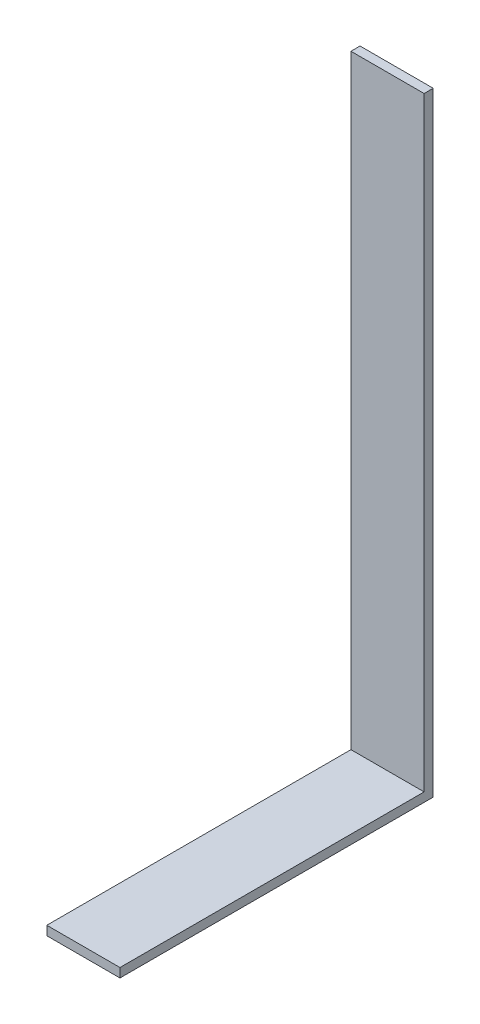
ISO-10303-21;
HEADER;
FILE_DESCRIPTION(('STEP AP214'),'2;1');
FILE_NAME('part.step','',(''),(''),'','','');
FILE_SCHEMA(('AUTOMOTIVE_DESIGN { 1 0 10303 214 1 1 1 1 }'));
ENDSEC;
DATA;
#1=APPLICATION_CONTEXT('core data for automotive mechanical design processes');
#2=APPLICATION_PROTOCOL_DEFINITION('international standard','automotive_design',2000,#1);
#3=PRODUCT_CONTEXT('',#1,'mechanical');
#4=PRODUCT('Part','Part','',(#3));
#5=PRODUCT_RELATED_PRODUCT_CATEGORY('part','',(#4));
#6=PRODUCT_DEFINITION_FORMATION('','',#4);
#7=PRODUCT_DEFINITION_CONTEXT('part definition',#1,'design');
#8=PRODUCT_DEFINITION('design','',#6,#7);
#9=PRODUCT_DEFINITION_SHAPE('','',#8);
#10=(LENGTH_UNIT() NAMED_UNIT(*) SI_UNIT(.MILLI.,.METRE.));
#11=(NAMED_UNIT(*) PLANE_ANGLE_UNIT() SI_UNIT($,.RADIAN.));
#12=(NAMED_UNIT(*) SI_UNIT($,.STERADIAN.) SOLID_ANGLE_UNIT());
#13=UNCERTAINTY_MEASURE_WITH_UNIT(LENGTH_MEASURE(1.E-05),#10,'distance_accuracy_value','');
#14=(GEOMETRIC_REPRESENTATION_CONTEXT(3) GLOBAL_UNCERTAINTY_ASSIGNED_CONTEXT((#13)) GLOBAL_UNIT_ASSIGNED_CONTEXT((#10,
#11,#12)) REPRESENTATION_CONTEXT('',''));
#15=CARTESIAN_POINT('',(0.,0.,0.));
#16=DIRECTION('',(0.,0.,1.));
#17=DIRECTION('',(1.,0.,0.));
#18=AXIS2_PLACEMENT_3D('',#15,#16,#17);
#19=CARTESIAN_POINT('',(25.4,3.155,285.44));
#20=DIRECTION('',(-1.,0.,0.));
#21=DIRECTION('',(0.,0.,1.));
#22=AXIS2_PLACEMENT_3D('',#19,#20,#21);
#23=PLANE('',#22);
#24=DIRECTION('',(0.,1.,0.));
#25=VECTOR('',#24,1.);
#26=CARTESIAN_POINT('',(25.4,3.155,0.));
#27=LINE('',#26,#25);
#28=CARTESIAN_POINT('',(25.4,-3.155,0.));
#29=VERTEX_POINT('',#28);
#30=CARTESIAN_POINT('',(25.4,423.015,0.));
#31=VERTEX_POINT('',#30);
#32=EDGE_CURVE('E109',#29,#31,#27,.T.);
#33=ORIENTED_EDGE('',*,*,#32,.T.);
#34=DIRECTION('',(0.,0.,-1.));
#35=VECTOR('',#34,1.);
#36=CARTESIAN_POINT('',(25.4,423.015,48.1200000000001));
#37=LINE('',#36,#35);
#38=CARTESIAN_POINT('',(25.4,423.015,6.31));
#39=VERTEX_POINT('',#38);
#40=EDGE_CURVE('E89',#39,#31,#37,.T.);
#41=ORIENTED_EDGE('',*,*,#40,.F.);
#42=DIRECTION('',(0.,-1.,0.));
#43=VECTOR('',#42,1.);
#44=CARTESIAN_POINT('',(25.4,541.355,6.31));
#45=LINE('',#44,#43);
#46=CARTESIAN_POINT('',(25.4,3.155,6.31000000000004));
#47=VERTEX_POINT('',#46);
#48=EDGE_CURVE('E135',#39,#47,#45,.T.);
#49=ORIENTED_EDGE('',*,*,#48,.T.);
#50=DIRECTION('',(0.,0.,-1.));
#51=VECTOR('',#50,1.);
#52=CARTESIAN_POINT('',(25.4,3.155,285.44));
#53=LINE('',#52,#51);
#54=CARTESIAN_POINT('',(25.4,3.155,217.44));
#55=VERTEX_POINT('',#54);
#56=EDGE_CURVE('E44',#55,#47,#53,.T.);
#57=ORIENTED_EDGE('',*,*,#56,.F.);
#58=DIRECTION('',(0.,-1.,0.));
#59=VECTOR('',#58,1.);
#60=CARTESIAN_POINT('',(25.4,6.845,217.44));
#61=LINE('',#60,#59);
#62=CARTESIAN_POINT('',(25.4,-3.155,217.44));
#63=VERTEX_POINT('',#62);
#64=EDGE_CURVE('E140',#55,#63,#61,.T.);
#65=ORIENTED_EDGE('',*,*,#64,.T.);
#66=DIRECTION('',(0.,0.,-1.));
#67=VECTOR('',#66,1.);
#68=CARTESIAN_POINT('',(25.4,-3.155,285.44));
#69=LINE('',#68,#67);
#70=EDGE_CURVE('E111',#63,#29,#69,.T.);
#71=ORIENTED_EDGE('',*,*,#70,.T.);
#72=EDGE_LOOP('',(#33,#41,#49,#57,#65,#71));
#73=FACE_BOUND('',#72,.T.);
#74=ADVANCED_FACE('F37',(#73),#23,.F.);
#75=CARTESIAN_POINT('',(-25.4,3.155,285.44));
#76=DIRECTION('',(0.,-1.,0.));
#77=DIRECTION('',(0.,0.,-1.));
#78=AXIS2_PLACEMENT_3D('',#75,#76,#77);
#79=PLANE('',#78);
#80=DIRECTION('',(0.,0.,-1.));
#81=VECTOR('',#80,1.);
#82=CARTESIAN_POINT('',(-25.4,3.155,285.44));
#83=LINE('',#82,#81);
#84=CARTESIAN_POINT('',(-25.4,3.155,217.44));
#85=VERTEX_POINT('',#84);
#86=CARTESIAN_POINT('',(-25.4,3.155,6.30999999999998));
#87=VERTEX_POINT('',#86);
#88=EDGE_CURVE('E120',#85,#87,#83,.T.);
#89=ORIENTED_EDGE('',*,*,#88,.F.);
#90=DIRECTION('',(1.,0.,0.));
#91=VECTOR('',#90,1.);
#92=CARTESIAN_POINT('',(-25.4,3.155,217.44));
#93=LINE('',#92,#91);
#94=EDGE_CURVE('E129',#85,#55,#93,.T.);
#95=ORIENTED_EDGE('',*,*,#94,.T.);
#96=ORIENTED_EDGE('',*,*,#56,.T.);
#97=DIRECTION('',(-1.,0.,0.));
#98=VECTOR('',#97,1.);
#99=CARTESIAN_POINT('',(-25.3999999999999,3.155,6.30999999999998));
#100=LINE('',#99,#98);
#101=EDGE_CURVE('E113',#47,#87,#100,.T.);
#102=ORIENTED_EDGE('',*,*,#101,.T.);
#103=EDGE_LOOP('',(#89,#95,#96,#102));
#104=FACE_BOUND('',#103,.T.);
#105=ADVANCED_FACE('F128',(#104),#79,.F.);
#106=CARTESIAN_POINT('',(-25.4,3.155,285.44));
#107=DIRECTION('',(1.,0.,0.));
#108=DIRECTION('',(0.,0.,-1.));
#109=AXIS2_PLACEMENT_3D('',#106,#107,#108);
#110=PLANE('',#109);
#111=DIRECTION('',(0.,-1.,0.));
#112=VECTOR('',#111,1.);
#113=CARTESIAN_POINT('',(-25.4,541.355,6.30999999999998));
#114=LINE('',#113,#112);
#115=CARTESIAN_POINT('',(-25.4,423.015,6.30999999999998));
#116=VERTEX_POINT('',#115);
#117=EDGE_CURVE('E103',#116,#87,#114,.T.);
#118=ORIENTED_EDGE('',*,*,#117,.F.);
#119=DIRECTION('',(0.,0.,-1.));
#120=VECTOR('',#119,1.);
#121=CARTESIAN_POINT('',(-25.4,423.015,48.1200000000001));
#122=LINE('',#121,#120);
#123=CARTESIAN_POINT('',(-25.4,423.015,0.));
#124=VERTEX_POINT('',#123);
#125=EDGE_CURVE('E50',#116,#124,#122,.T.);
#126=ORIENTED_EDGE('',*,*,#125,.T.);
#127=DIRECTION('',(0.,-1.,0.));
#128=VECTOR('',#127,1.);
#129=CARTESIAN_POINT('',(-25.4,3.155,0.));
#130=LINE('',#129,#128);
#131=CARTESIAN_POINT('',(-25.4,-3.155,0.));
#132=VERTEX_POINT('',#131);
#133=EDGE_CURVE('E100',#124,#132,#130,.T.);
#134=ORIENTED_EDGE('',*,*,#133,.T.);
#135=DIRECTION('',(0.,0.,-1.));
#136=VECTOR('',#135,1.);
#137=CARTESIAN_POINT('',(-25.4,-3.155,285.44));
#138=LINE('',#137,#136);
#139=CARTESIAN_POINT('',(-25.4,-3.155,217.44));
#140=VERTEX_POINT('',#139);
#141=EDGE_CURVE('E118',#140,#132,#138,.T.);
#142=ORIENTED_EDGE('',*,*,#141,.F.);
#143=DIRECTION('',(0.,-1.,0.));
#144=VECTOR('',#143,1.);
#145=CARTESIAN_POINT('',(-25.4,6.845,217.44));
#146=LINE('',#145,#144);
#147=EDGE_CURVE('E58',#85,#140,#146,.T.);
#148=ORIENTED_EDGE('',*,*,#147,.F.);
#149=ORIENTED_EDGE('',*,*,#88,.T.);
#150=EDGE_LOOP('',(#118,#126,#134,#142,#148,#149));
#151=FACE_BOUND('',#150,.T.);
#152=ADVANCED_FACE('F98',(#151),#110,.F.);
#153=CARTESIAN_POINT('',(-25.4,-3.155,285.44));
#154=DIRECTION('',(0.,1.,0.));
#155=DIRECTION('',(0.,0.,1.));
#156=AXIS2_PLACEMENT_3D('',#153,#154,#155);
#157=PLANE('',#156);
#158=ORIENTED_EDGE('',*,*,#70,.F.);
#159=DIRECTION('',(1.,0.,0.));
#160=VECTOR('',#159,1.);
#161=CARTESIAN_POINT('',(-25.4,-3.155,217.44));
#162=LINE('',#161,#160);
#163=EDGE_CURVE('E94',#140,#63,#162,.T.);
#164=ORIENTED_EDGE('',*,*,#163,.F.);
#165=ORIENTED_EDGE('',*,*,#141,.T.);
#166=DIRECTION('',(1.,0.,0.));
#167=VECTOR('',#166,1.);
#168=CARTESIAN_POINT('',(-25.4,-3.155,0.));
#169=LINE('',#168,#167);
#170=EDGE_CURVE('E108',#132,#29,#169,.T.);
#171=ORIENTED_EDGE('',*,*,#170,.T.);
#172=EDGE_LOOP('',(#158,#164,#165,#171));
#173=FACE_BOUND('',#172,.T.);
#174=ADVANCED_FACE('F147',(#173),#157,.F.);
#175=CARTESIAN_POINT('',(0.,0.,0.));
#176=DIRECTION('',(0.,0.,1.));
#177=DIRECTION('',(1.,0.,0.));
#178=AXIS2_PLACEMENT_3D('',#175,#176,#177);
#179=PLANE('',#178);
#180=ORIENTED_EDGE('',*,*,#133,.F.);
#181=DIRECTION('',(1.,0.,0.));
#182=VECTOR('',#181,1.);
#183=CARTESIAN_POINT('',(-25.4,423.015,0.));
#184=LINE('',#183,#182);
#185=EDGE_CURVE('E86',#124,#31,#184,.T.);
#186=ORIENTED_EDGE('',*,*,#185,.T.);
#187=ORIENTED_EDGE('',*,*,#32,.F.);
#188=ORIENTED_EDGE('',*,*,#170,.F.);
#189=EDGE_LOOP('',(#180,#186,#187,#188));
#190=FACE_BOUND('',#189,.T.);
#191=ADVANCED_FACE('F106',(#190),#179,.F.);
#192=CARTESIAN_POINT('',(25.4,541.355,6.31));
#193=DIRECTION('',(0.,0.,1.));
#194=DIRECTION('',(1.,0.,0.));
#195=AXIS2_PLACEMENT_3D('',#192,#193,#194);
#196=PLANE('',#195);
#197=DIRECTION('',(1.,0.,0.));
#198=VECTOR('',#197,1.);
#199=CARTESIAN_POINT('',(25.4,423.015,6.31));
#200=LINE('',#199,#198);
#201=EDGE_CURVE('E11',#116,#39,#200,.T.);
#202=ORIENTED_EDGE('',*,*,#201,.F.);
#203=ORIENTED_EDGE('',*,*,#117,.T.);
#204=ORIENTED_EDGE('',*,*,#101,.F.);
#205=ORIENTED_EDGE('',*,*,#48,.F.);
#206=EDGE_LOOP('',(#202,#203,#204,#205));
#207=FACE_BOUND('',#206,.T.);
#208=ADVANCED_FACE('F134',(#207),#196,.T.);
#209=CARTESIAN_POINT('',(-25.4,6.845,217.44));
#210=DIRECTION('',(0.,0.,-1.));
#211=DIRECTION('',(-1.,0.,0.));
#212=AXIS2_PLACEMENT_3D('',#209,#210,#211);
#213=PLANE('',#212);
#214=ORIENTED_EDGE('',*,*,#147,.T.);
#215=ORIENTED_EDGE('',*,*,#163,.T.);
#216=ORIENTED_EDGE('',*,*,#64,.F.);
#217=ORIENTED_EDGE('',*,*,#94,.F.);
#218=EDGE_LOOP('',(#214,#215,#216,#217));
#219=FACE_BOUND('',#218,.T.);
#220=ADVANCED_FACE('F144',(#219),#213,.F.);
#221=CARTESIAN_POINT('',(-25.4,423.015,48.1200000000001));
#222=DIRECTION('',(0.,-1.,0.));
#223=DIRECTION('',(0.,0.,-1.));
#224=AXIS2_PLACEMENT_3D('',#221,#222,#223);
#225=PLANE('',#224);
#226=ORIENTED_EDGE('',*,*,#201,.T.);
#227=ORIENTED_EDGE('',*,*,#40,.T.);
#228=ORIENTED_EDGE('',*,*,#185,.F.);
#229=ORIENTED_EDGE('',*,*,#125,.F.);
#230=EDGE_LOOP('',(#226,#227,#228,#229));
#231=FACE_BOUND('',#230,.T.);
#232=ADVANCED_FACE('F87',(#231),#225,.F.);
#233=CLOSED_SHELL('',(#74,#105,#152,#174,#191,#208,#220,#232));
#234=MANIFOLD_SOLID_BREP('B2',#233);
#235=ADVANCED_BREP_SHAPE_REPRESENTATION('',(#18,#234),#14);
#236=SHAPE_DEFINITION_REPRESENTATION(#9,#235);
ENDSEC;
END-ISO-10303-21;
